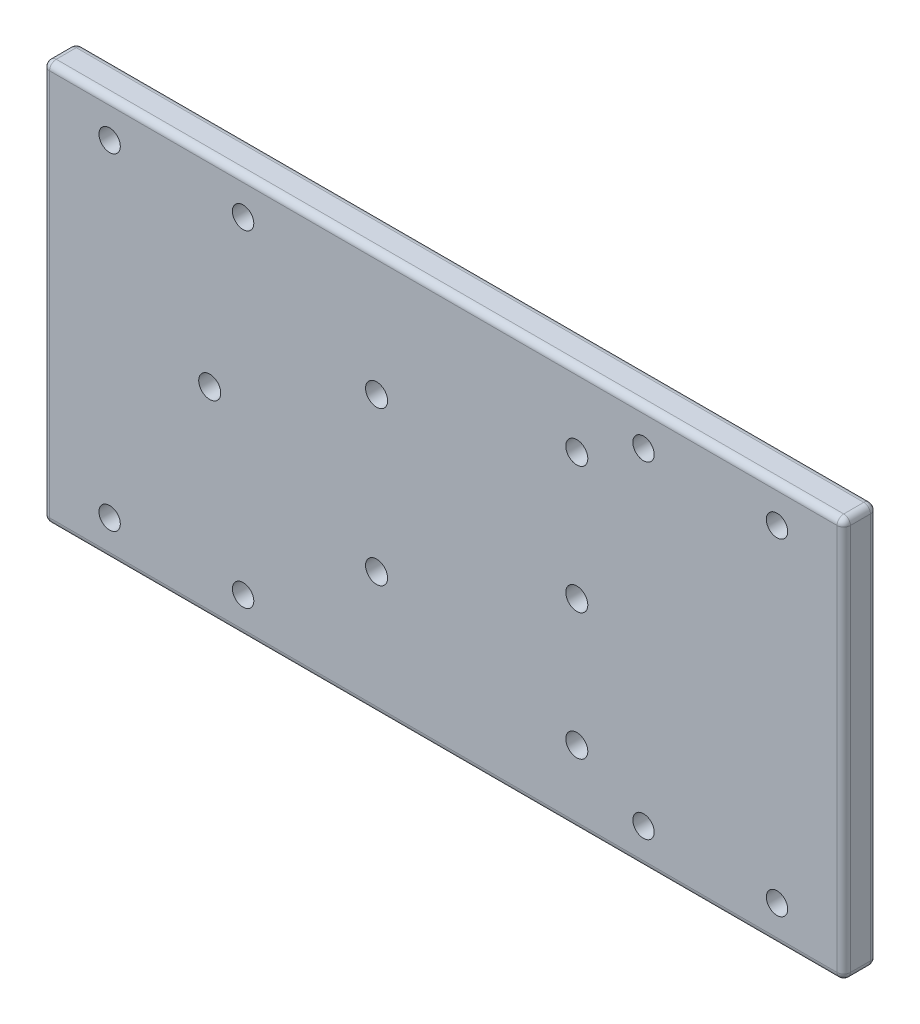
ISO-10303-21;
HEADER;
FILE_DESCRIPTION(('STEP AP214'),'2;1');
FILE_NAME('part.step','',(''),(''),'','','');
FILE_SCHEMA(('AUTOMOTIVE_DESIGN { 1 0 10303 214 1 1 1 1 }'));
ENDSEC;
DATA;
#1=APPLICATION_CONTEXT('core data for automotive mechanical design processes');
#2=APPLICATION_PROTOCOL_DEFINITION('international standard','automotive_design',2000,#1);
#3=PRODUCT_CONTEXT('',#1,'mechanical');
#4=PRODUCT('Part','Part','',(#3));
#5=PRODUCT_RELATED_PRODUCT_CATEGORY('part','',(#4));
#6=PRODUCT_DEFINITION_FORMATION('','',#4);
#7=PRODUCT_DEFINITION_CONTEXT('part definition',#1,'design');
#8=PRODUCT_DEFINITION('design','',#6,#7);
#9=PRODUCT_DEFINITION_SHAPE('','',#8);
#10=(LENGTH_UNIT() NAMED_UNIT(*) SI_UNIT(.MILLI.,.METRE.));
#11=(NAMED_UNIT(*) PLANE_ANGLE_UNIT() SI_UNIT($,.RADIAN.));
#12=(NAMED_UNIT(*) SI_UNIT($,.STERADIAN.) SOLID_ANGLE_UNIT());
#13=UNCERTAINTY_MEASURE_WITH_UNIT(LENGTH_MEASURE(1.E-05),#10,'distance_accuracy_value','');
#14=(GEOMETRIC_REPRESENTATION_CONTEXT(3) GLOBAL_UNCERTAINTY_ASSIGNED_CONTEXT((#13)) GLOBAL_UNIT_ASSIGNED_CONTEXT((#10,
#11,#12)) REPRESENTATION_CONTEXT('',''));
#15=CARTESIAN_POINT('',(0.,0.,0.));
#16=DIRECTION('',(0.,0.,1.));
#17=DIRECTION('',(1.,0.,0.));
#18=AXIS2_PLACEMENT_3D('',#15,#16,#17);
#19=CARTESIAN_POINT('',(20.,5.50000000000001,5.));
#20=DIRECTION('',(-1.,0.,0.));
#21=DIRECTION('',(0.,0.,1.));
#22=AXIS2_PLACEMENT_3D('',#19,#20,#21);
#23=PLANE('',#22);
#24=DIRECTION('',(0.,1.,0.));
#25=VECTOR('',#24,1.);
#26=CARTESIAN_POINT('',(20.,5.50000000000001,4.));
#27=LINE('',#26,#25);
#28=CARTESIAN_POINT('',(20.,4.5,4.));
#29=VERTEX_POINT('',#28);
#30=CARTESIAN_POINT('',(20.,-53.5,4.));
#31=VERTEX_POINT('',#30);
#32=EDGE_CURVE('E50',#29,#31,#27,.F.);
#33=ORIENTED_EDGE('',*,*,#32,.T.);
#34=DIRECTION('',(0.,0.,-1.));
#35=VECTOR('',#34,1.);
#36=CARTESIAN_POINT('',(20.,-53.5,5.));
#37=LINE('',#36,#35);
#38=CARTESIAN_POINT('',(20.,-53.5,1.));
#39=VERTEX_POINT('',#38);
#40=EDGE_CURVE('E11',#31,#39,#37,.T.);
#41=ORIENTED_EDGE('',*,*,#40,.T.);
#42=DIRECTION('',(0.,1.,0.));
#43=VECTOR('',#42,1.);
#44=CARTESIAN_POINT('',(20.,5.50000000000001,1.));
#45=LINE('',#44,#43);
#46=CARTESIAN_POINT('',(20.,4.5,1.));
#47=VERTEX_POINT('',#46);
#48=EDGE_CURVE('E204',#39,#47,#45,.T.);
#49=ORIENTED_EDGE('',*,*,#48,.T.);
#50=DIRECTION('',(0.,0.,-1.));
#51=VECTOR('',#50,1.);
#52=CARTESIAN_POINT('',(20.,4.5,5.));
#53=LINE('',#52,#51);
#54=EDGE_CURVE('E61',#47,#29,#53,.F.);
#55=ORIENTED_EDGE('',*,*,#54,.T.);
#56=EDGE_LOOP('',(#33,#41,#49,#55));
#57=FACE_BOUND('',#56,.T.);
#58=ADVANCED_FACE('F41',(#57),#23,.F.);
#59=CARTESIAN_POINT('',(20.,5.50000000000001,5.));
#60=DIRECTION('',(0.,-1.,0.));
#61=DIRECTION('',(1.,0.,0.));
#62=AXIS2_PLACEMENT_3D('',#59,#60,#61);
#63=PLANE('',#62);
#64=DIRECTION('',(0.,0.,-1.));
#65=VECTOR('',#64,1.);
#66=CARTESIAN_POINT('',(-99.,5.50000000000002,5.));
#67=LINE('',#66,#65);
#68=CARTESIAN_POINT('',(-99.,5.50000000000002,1.));
#69=VERTEX_POINT('',#68);
#70=CARTESIAN_POINT('',(-99.,5.50000000000002,4.));
#71=VERTEX_POINT('',#70);
#72=EDGE_CURVE('E199',#69,#71,#67,.F.);
#73=ORIENTED_EDGE('',*,*,#72,.T.);
#74=DIRECTION('',(-1.,0.,0.));
#75=VECTOR('',#74,1.);
#76=CARTESIAN_POINT('',(20.,5.50000000000001,4.));
#77=LINE('',#76,#75);
#78=CARTESIAN_POINT('',(19.,5.50000000000001,4.));
#79=VERTEX_POINT('',#78);
#80=EDGE_CURVE('E201',#71,#79,#77,.F.);
#81=ORIENTED_EDGE('',*,*,#80,.T.);
#82=DIRECTION('',(0.,0.,-1.));
#83=VECTOR('',#82,1.);
#84=CARTESIAN_POINT('',(19.,5.50000000000001,5.));
#85=LINE('',#84,#83);
#86=CARTESIAN_POINT('',(19.,5.50000000000001,1.));
#87=VERTEX_POINT('',#86);
#88=EDGE_CURVE('E195',#79,#87,#85,.T.);
#89=ORIENTED_EDGE('',*,*,#88,.T.);
#90=DIRECTION('',(-1.,0.,0.));
#91=VECTOR('',#90,1.);
#92=CARTESIAN_POINT('',(-100.,5.50000000000002,1.));
#93=LINE('',#92,#91);
#94=EDGE_CURVE('E197',#87,#69,#93,.T.);
#95=ORIENTED_EDGE('',*,*,#94,.T.);
#96=EDGE_LOOP('',(#73,#81,#89,#95));
#97=FACE_BOUND('',#96,.T.);
#98=ADVANCED_FACE('F396',(#97),#63,.F.);
#99=CARTESIAN_POINT('',(-100.,5.50000000000002,5.));
#100=DIRECTION('',(1.,0.,0.));
#101=DIRECTION('',(0.,0.,-1.));
#102=AXIS2_PLACEMENT_3D('',#99,#100,#101);
#103=PLANE('',#102);
#104=DIRECTION('',(0.,0.,-1.));
#105=VECTOR('',#104,1.);
#106=CARTESIAN_POINT('',(-100.,-53.5,5.));
#107=LINE('',#106,#105);
#108=CARTESIAN_POINT('',(-100.,-53.5,1.));
#109=VERTEX_POINT('',#108);
#110=CARTESIAN_POINT('',(-100.,-53.5,4.));
#111=VERTEX_POINT('',#110);
#112=EDGE_CURVE('E190',#109,#111,#107,.F.);
#113=ORIENTED_EDGE('',*,*,#112,.T.);
#114=DIRECTION('',(0.,-1.,0.));
#115=VECTOR('',#114,1.);
#116=CARTESIAN_POINT('',(-100.,5.50000000000002,4.));
#117=LINE('',#116,#115);
#118=CARTESIAN_POINT('',(-100.,4.50000000000002,4.));
#119=VERTEX_POINT('',#118);
#120=EDGE_CURVE('E192',#111,#119,#117,.F.);
#121=ORIENTED_EDGE('',*,*,#120,.T.);
#122=DIRECTION('',(0.,0.,-1.));
#123=VECTOR('',#122,1.);
#124=CARTESIAN_POINT('',(-100.,4.50000000000002,5.));
#125=LINE('',#124,#123);
#126=CARTESIAN_POINT('',(-100.,4.50000000000002,1.));
#127=VERTEX_POINT('',#126);
#128=EDGE_CURVE('E186',#119,#127,#125,.T.);
#129=ORIENTED_EDGE('',*,*,#128,.T.);
#130=DIRECTION('',(0.,-1.,0.));
#131=VECTOR('',#130,1.);
#132=CARTESIAN_POINT('',(-100.,-54.5,1.));
#133=LINE('',#132,#131);
#134=EDGE_CURVE('E188',#127,#109,#133,.T.);
#135=ORIENTED_EDGE('',*,*,#134,.T.);
#136=EDGE_LOOP('',(#113,#121,#129,#135));
#137=FACE_BOUND('',#136,.T.);
#138=ADVANCED_FACE('F402',(#137),#103,.F.);
#139=CARTESIAN_POINT('',(20.,-54.5,5.));
#140=DIRECTION('',(0.,1.,0.));
#141=DIRECTION('',(-1.,0.,0.));
#142=AXIS2_PLACEMENT_3D('',#139,#140,#141);
#143=PLANE('',#142);
#144=DIRECTION('',(1.,0.,0.));
#145=VECTOR('',#144,1.);
#146=CARTESIAN_POINT('',(20.,-54.5,4.));
#147=LINE('',#146,#145);
#148=CARTESIAN_POINT('',(19.,-54.5,4.));
#149=VERTEX_POINT('',#148);
#150=CARTESIAN_POINT('',(-99.,-54.5,4.));
#151=VERTEX_POINT('',#150);
#152=EDGE_CURVE('E137',#149,#151,#147,.F.);
#153=ORIENTED_EDGE('',*,*,#152,.T.);
#154=DIRECTION('',(0.,0.,-1.));
#155=VECTOR('',#154,1.);
#156=CARTESIAN_POINT('',(-99.,-54.5,5.));
#157=LINE('',#156,#155);
#158=CARTESIAN_POINT('',(-99.,-54.5,1.));
#159=VERTEX_POINT('',#158);
#160=EDGE_CURVE('E175',#151,#159,#157,.T.);
#161=ORIENTED_EDGE('',*,*,#160,.T.);
#162=DIRECTION('',(1.,0.,0.));
#163=VECTOR('',#162,1.);
#164=CARTESIAN_POINT('',(20.,-54.5,1.));
#165=LINE('',#164,#163);
#166=CARTESIAN_POINT('',(19.,-54.5,1.));
#167=VERTEX_POINT('',#166);
#168=EDGE_CURVE('E168',#159,#167,#165,.T.);
#169=ORIENTED_EDGE('',*,*,#168,.T.);
#170=DIRECTION('',(0.,0.,-1.));
#171=VECTOR('',#170,1.);
#172=CARTESIAN_POINT('',(19.,-54.5,5.));
#173=LINE('',#172,#171);
#174=EDGE_CURVE('E166',#167,#149,#173,.F.);
#175=ORIENTED_EDGE('',*,*,#174,.T.);
#176=EDGE_LOOP('',(#153,#161,#169,#175));
#177=FACE_BOUND('',#176,.T.);
#178=ADVANCED_FACE('F367',(#177),#143,.F.);
#179=CARTESIAN_POINT('',(0.,0.,5.));
#180=DIRECTION('',(0.,0.,-1.));
#181=DIRECTION('',(-1.,0.,0.));
#182=AXIS2_PLACEMENT_3D('',#179,#180,#181);
#183=PLANE('',#182);
#184=DIRECTION('',(0.,-1.,0.));
#185=VECTOR('',#184,1.);
#186=CARTESIAN_POINT('',(-99.,0.,5.));
#187=LINE('',#186,#185);
#188=CARTESIAN_POINT('',(-99.,4.50000000000002,5.));
#189=VERTEX_POINT('',#188);
#190=CARTESIAN_POINT('',(-99.,-53.5,5.));
#191=VERTEX_POINT('',#190);
#192=EDGE_CURVE('E164',#189,#191,#187,.T.);
#193=ORIENTED_EDGE('',*,*,#192,.T.);
#194=DIRECTION('',(1.,0.,0.));
#195=VECTOR('',#194,1.);
#196=CARTESIAN_POINT('',(0.,-53.5,5.));
#197=LINE('',#196,#195);
#198=CARTESIAN_POINT('',(19.,-53.5,5.));
#199=VERTEX_POINT('',#198);
#200=EDGE_CURVE('E135',#191,#199,#197,.T.);
#201=ORIENTED_EDGE('',*,*,#200,.T.);
#202=DIRECTION('',(0.,1.,0.));
#203=VECTOR('',#202,1.);
#204=CARTESIAN_POINT('',(19.,0.,5.));
#205=LINE('',#204,#203);
#206=CARTESIAN_POINT('',(19.,4.5,5.));
#207=VERTEX_POINT('',#206);
#208=EDGE_CURVE('E152',#199,#207,#205,.T.);
#209=ORIENTED_EDGE('',*,*,#208,.T.);
#210=DIRECTION('',(-1.,0.,0.));
#211=VECTOR('',#210,1.);
#212=CARTESIAN_POINT('',(0.,4.50000000000001,5.));
#213=LINE('',#212,#211);
#214=EDGE_CURVE('E158',#207,#189,#213,.T.);
#215=ORIENTED_EDGE('',*,*,#214,.T.);
#216=EDGE_LOOP('',(#193,#201,#209,#215));
#217=FACE_BOUND('',#216,.T.);
#218=CARTESIAN_POINT('',(-20.,-43.5,5.));
#219=DIRECTION('',(0.,0.,1.));
#220=DIRECTION('',(1.,0.,0.));
#221=AXIS2_PLACEMENT_3D('',#218,#219,#220);
#222=CIRCLE('',#221,1.65);
#223=CARTESIAN_POINT('',(-18.35,-43.5,5.));
#224=VERTEX_POINT('',#223);
#225=EDGE_CURVE('E295',#224,#224,#222,.T.);
#226=ORIENTED_EDGE('',*,*,#225,.F.);
#227=EDGE_LOOP('',(#226));
#228=FACE_BOUND('',#227,.T.);
#229=CARTESIAN_POINT('',(-20.,-24.5,5.));
#230=DIRECTION('',(0.,0.,1.));
#231=DIRECTION('',(1.,0.,0.));
#232=AXIS2_PLACEMENT_3D('',#229,#230,#231);
#233=CIRCLE('',#232,1.65);
#234=CARTESIAN_POINT('',(-18.35,-24.5,5.));
#235=VERTEX_POINT('',#234);
#236=EDGE_CURVE('E274',#235,#235,#233,.T.);
#237=ORIENTED_EDGE('',*,*,#236,.F.);
#238=EDGE_LOOP('',(#237));
#239=FACE_BOUND('',#238,.T.);
#240=CARTESIAN_POINT('',(-20.,-5.49999999999999,5.));
#241=DIRECTION('',(0.,0.,1.));
#242=DIRECTION('',(1.,0.,0.));
#243=AXIS2_PLACEMENT_3D('',#240,#241,#242);
#244=CIRCLE('',#243,1.65);
#245=CARTESIAN_POINT('',(-18.35,-5.49999999999999,5.));
#246=VERTEX_POINT('',#245);
#247=EDGE_CURVE('E263',#246,#246,#244,.T.);
#248=ORIENTED_EDGE('',*,*,#247,.F.);
#249=EDGE_LOOP('',(#248));
#250=FACE_BOUND('',#249,.T.);
#251=CARTESIAN_POINT('',(-10.,-49.,5.));
#252=DIRECTION('',(0.,0.,-1.));
#253=DIRECTION('',(-1.,0.,0.));
#254=AXIS2_PLACEMENT_3D('',#251,#252,#253);
#255=CIRCLE('',#254,1.6);
#256=CARTESIAN_POINT('',(-11.6,-49.,5.));
#257=VERTEX_POINT('',#256);
#258=EDGE_CURVE('E285',#257,#257,#255,.F.);
#259=ORIENTED_EDGE('',*,*,#258,.F.);
#260=EDGE_LOOP('',(#259));
#261=FACE_BOUND('',#260,.T.);
#262=CARTESIAN_POINT('',(-90.,-49.,5.));
#263=DIRECTION('',(0.,0.,-1.));
#264=DIRECTION('',(-1.,0.,0.));
#265=AXIS2_PLACEMENT_3D('',#262,#263,#264);
#266=CIRCLE('',#265,1.59999999999999);
#267=CARTESIAN_POINT('',(-91.6,-49.,5.));
#268=VERTEX_POINT('',#267);
#269=EDGE_CURVE('E298',#268,#268,#266,.F.);
#270=ORIENTED_EDGE('',*,*,#269,.F.);
#271=EDGE_LOOP('',(#270));
#272=FACE_BOUND('',#271,.T.);
#273=CARTESIAN_POINT('',(-70.,-49.,5.));
#274=DIRECTION('',(0.,0.,-1.));
#275=DIRECTION('',(-1.,0.,0.));
#276=AXIS2_PLACEMENT_3D('',#273,#274,#275);
#277=CIRCLE('',#276,1.59999999999999);
#278=CARTESIAN_POINT('',(-71.6,-49.,5.));
#279=VERTEX_POINT('',#278);
#280=EDGE_CURVE('E305',#279,#279,#277,.F.);
#281=ORIENTED_EDGE('',*,*,#280,.F.);
#282=EDGE_LOOP('',(#281));
#283=FACE_BOUND('',#282,.T.);
#284=CARTESIAN_POINT('',(-70.,0.,5.));
#285=DIRECTION('',(0.,0.,-1.));
#286=DIRECTION('',(-1.,0.,0.));
#287=AXIS2_PLACEMENT_3D('',#284,#285,#286);
#288=CIRCLE('',#287,1.60000000000001);
#289=CARTESIAN_POINT('',(-71.6,0.,5.));
#290=VERTEX_POINT('',#289);
#291=EDGE_CURVE('E310',#290,#290,#288,.F.);
#292=ORIENTED_EDGE('',*,*,#291,.F.);
#293=EDGE_LOOP('',(#292));
#294=FACE_BOUND('',#293,.T.);
#295=CARTESIAN_POINT('',(10.,-49.,5.));
#296=DIRECTION('',(0.,0.,-1.));
#297=DIRECTION('',(-1.,0.,0.));
#298=AXIS2_PLACEMENT_3D('',#295,#296,#297);
#299=CIRCLE('',#298,1.6);
#300=CARTESIAN_POINT('',(8.4,-49.,5.));
#301=VERTEX_POINT('',#300);
#302=EDGE_CURVE('E278',#301,#301,#299,.F.);
#303=ORIENTED_EDGE('',*,*,#302,.F.);
#304=EDGE_LOOP('',(#303));
#305=FACE_BOUND('',#304,.T.);
#306=CARTESIAN_POINT('',(10.,0.,5.));
#307=DIRECTION('',(0.,0.,-1.));
#308=DIRECTION('',(-1.,0.,0.));
#309=AXIS2_PLACEMENT_3D('',#306,#307,#308);
#310=CIRCLE('',#309,1.6);
#311=CARTESIAN_POINT('',(8.4,0.,5.));
#312=VERTEX_POINT('',#311);
#313=EDGE_CURVE('E286',#312,#312,#310,.F.);
#314=ORIENTED_EDGE('',*,*,#313,.F.);
#315=EDGE_LOOP('',(#314));
#316=FACE_BOUND('',#315,.T.);
#317=CARTESIAN_POINT('',(-10.,0.,5.));
#318=DIRECTION('',(0.,0.,-1.));
#319=DIRECTION('',(-1.,0.,0.));
#320=AXIS2_PLACEMENT_3D('',#317,#318,#319);
#321=CIRCLE('',#320,1.6);
#322=CARTESIAN_POINT('',(-11.6,0.,5.));
#323=VERTEX_POINT('',#322);
#324=EDGE_CURVE('E292',#323,#323,#321,.F.);
#325=ORIENTED_EDGE('',*,*,#324,.F.);
#326=EDGE_LOOP('',(#325));
#327=FACE_BOUND('',#326,.T.);
#328=CARTESIAN_POINT('',(-90.,0.,5.));
#329=DIRECTION('',(0.,0.,-1.));
#330=DIRECTION('',(-1.,0.,0.));
#331=AXIS2_PLACEMENT_3D('',#328,#329,#330);
#332=CIRCLE('',#331,1.6);
#333=CARTESIAN_POINT('',(-91.6,0.,5.));
#334=VERTEX_POINT('',#333);
#335=EDGE_CURVE('E324',#334,#334,#332,.F.);
#336=ORIENTED_EDGE('',*,*,#335,.F.);
#337=EDGE_LOOP('',(#336));
#338=FACE_BOUND('',#337,.T.);
#339=CARTESIAN_POINT('',(-50.,-13.,5.));
#340=DIRECTION('',(0.,0.,1.));
#341=DIRECTION('',(1.,0.,0.));
#342=AXIS2_PLACEMENT_3D('',#339,#340,#341);
#343=CIRCLE('',#342,1.65);
#344=CARTESIAN_POINT('',(-48.35,-13.,5.));
#345=VERTEX_POINT('',#344);
#346=EDGE_CURVE('E159',#345,#345,#343,.T.);
#347=ORIENTED_EDGE('',*,*,#346,.F.);
#348=EDGE_LOOP('',(#347));
#349=FACE_BOUND('',#348,.T.);
#350=CARTESIAN_POINT('',(-75.,-24.5,5.));
#351=DIRECTION('',(0.,0.,1.));
#352=DIRECTION('',(1.,0.,0.));
#353=AXIS2_PLACEMENT_3D('',#350,#351,#352);
#354=CIRCLE('',#353,1.65);
#355=CARTESIAN_POINT('',(-73.35,-24.5,5.));
#356=VERTEX_POINT('',#355);
#357=EDGE_CURVE('E336',#356,#356,#354,.T.);
#358=ORIENTED_EDGE('',*,*,#357,.F.);
#359=EDGE_LOOP('',(#358));
#360=FACE_BOUND('',#359,.T.);
#361=CARTESIAN_POINT('',(-50.,-36.,5.));
#362=DIRECTION('',(0.,0.,1.));
#363=DIRECTION('',(1.,0.,0.));
#364=AXIS2_PLACEMENT_3D('',#361,#362,#363);
#365=CIRCLE('',#364,1.65000000000001);
#366=CARTESIAN_POINT('',(-48.3499999999999,-36.,5.));
#367=VERTEX_POINT('',#366);
#368=EDGE_CURVE('E327',#367,#367,#365,.T.);
#369=ORIENTED_EDGE('',*,*,#368,.F.);
#370=EDGE_LOOP('',(#369));
#371=FACE_BOUND('',#370,.T.);
#372=ADVANCED_FACE('F161',(#217,#228,#239,#250,#261,#272,#283,#294,#305,#316,#327,#338,#349,
#360,#371),#183,.F.);
#373=CARTESIAN_POINT('',(0.,0.,0.));
#374=DIRECTION('',(0.,0.,-1.));
#375=DIRECTION('',(-1.,0.,0.));
#376=AXIS2_PLACEMENT_3D('',#373,#374,#375);
#377=PLANE('',#376);
#378=DIRECTION('',(0.,1.,0.));
#379=VECTOR('',#378,1.);
#380=CARTESIAN_POINT('',(19.,-54.5,0.));
#381=LINE('',#380,#379);
#382=CARTESIAN_POINT('',(19.,4.5,0.));
#383=VERTEX_POINT('',#382);
#384=CARTESIAN_POINT('',(19.,-53.5,0.));
#385=VERTEX_POINT('',#384);
#386=EDGE_CURVE('E177',#383,#385,#381,.F.);
#387=ORIENTED_EDGE('',*,*,#386,.T.);
#388=DIRECTION('',(1.,0.,0.));
#389=VECTOR('',#388,1.);
#390=CARTESIAN_POINT('',(-100.,-53.5,0.));
#391=LINE('',#390,#389);
#392=CARTESIAN_POINT('',(-99.,-53.5,0.));
#393=VERTEX_POINT('',#392);
#394=EDGE_CURVE('E183',#385,#393,#391,.F.);
#395=ORIENTED_EDGE('',*,*,#394,.T.);
#396=DIRECTION('',(0.,-1.,0.));
#397=VECTOR('',#396,1.);
#398=CARTESIAN_POINT('',(-99.,5.50000000000002,0.));
#399=LINE('',#398,#397);
#400=CARTESIAN_POINT('',(-99.,4.50000000000002,0.));
#401=VERTEX_POINT('',#400);
#402=EDGE_CURVE('E181',#393,#401,#399,.F.);
#403=ORIENTED_EDGE('',*,*,#402,.T.);
#404=DIRECTION('',(-1.,0.,0.));
#405=VECTOR('',#404,1.);
#406=CARTESIAN_POINT('',(20.,4.5,0.));
#407=LINE('',#406,#405);
#408=EDGE_CURVE('E179',#401,#383,#407,.F.);
#409=ORIENTED_EDGE('',*,*,#408,.T.);
#410=EDGE_LOOP('',(#387,#395,#403,#409));
#411=FACE_BOUND('',#410,.T.);
#412=CARTESIAN_POINT('',(-20.,-43.5,0.));
#413=DIRECTION('',(0.,0.,-1.));
#414=DIRECTION('',(-1.,0.,0.));
#415=AXIS2_PLACEMENT_3D('',#412,#413,#414);
#416=CIRCLE('',#415,1.65);
#417=CARTESIAN_POINT('',(-21.65,-43.5,0.));
#418=VERTEX_POINT('',#417);
#419=EDGE_CURVE('E746',#418,#418,#416,.F.);
#420=ORIENTED_EDGE('',*,*,#419,.T.);
#421=EDGE_LOOP('',(#420));
#422=FACE_BOUND('',#421,.T.);
#423=CARTESIAN_POINT('',(-20.,-24.5,0.));
#424=DIRECTION('',(0.,0.,-1.));
#425=DIRECTION('',(-1.,0.,0.));
#426=AXIS2_PLACEMENT_3D('',#423,#424,#425);
#427=CIRCLE('',#426,1.65);
#428=CARTESIAN_POINT('',(-21.65,-24.5,0.));
#429=VERTEX_POINT('',#428);
#430=EDGE_CURVE('E750',#429,#429,#427,.F.);
#431=ORIENTED_EDGE('',*,*,#430,.T.);
#432=EDGE_LOOP('',(#431));
#433=FACE_BOUND('',#432,.T.);
#434=CARTESIAN_POINT('',(-20.,-5.49999999999999,0.));
#435=DIRECTION('',(0.,0.,-1.));
#436=DIRECTION('',(-1.,0.,0.));
#437=AXIS2_PLACEMENT_3D('',#434,#435,#436);
#438=CIRCLE('',#437,1.65);
#439=CARTESIAN_POINT('',(-21.65,-5.49999999999999,0.));
#440=VERTEX_POINT('',#439);
#441=EDGE_CURVE('E269',#440,#440,#438,.F.);
#442=ORIENTED_EDGE('',*,*,#441,.T.);
#443=EDGE_LOOP('',(#442));
#444=FACE_BOUND('',#443,.T.);
#445=CARTESIAN_POINT('',(-10.,-49.,0.));
#446=DIRECTION('',(0.,0.,-1.));
#447=DIRECTION('',(-1.,0.,0.));
#448=AXIS2_PLACEMENT_3D('',#445,#446,#447);
#449=CIRCLE('',#448,1.6);
#450=CARTESIAN_POINT('',(-11.6,-49.,0.));
#451=VERTEX_POINT('',#450);
#452=EDGE_CURVE('E302',#451,#451,#449,.T.);
#453=ORIENTED_EDGE('',*,*,#452,.F.);
#454=EDGE_LOOP('',(#453));
#455=FACE_BOUND('',#454,.T.);
#456=CARTESIAN_POINT('',(-90.,-49.,0.));
#457=DIRECTION('',(0.,0.,-1.));
#458=DIRECTION('',(-1.,0.,0.));
#459=AXIS2_PLACEMENT_3D('',#456,#457,#458);
#460=CIRCLE('',#459,1.59999999999999);
#461=CARTESIAN_POINT('',(-91.6,-49.,0.));
#462=VERTEX_POINT('',#461);
#463=EDGE_CURVE('E301',#462,#462,#460,.T.);
#464=ORIENTED_EDGE('',*,*,#463,.F.);
#465=EDGE_LOOP('',(#464));
#466=FACE_BOUND('',#465,.T.);
#467=CARTESIAN_POINT('',(-70.,-49.,0.));
#468=DIRECTION('',(0.,0.,-1.));
#469=DIRECTION('',(-1.,0.,0.));
#470=AXIS2_PLACEMENT_3D('',#467,#468,#469);
#471=CIRCLE('',#470,1.59999999999999);
#472=CARTESIAN_POINT('',(-71.6,-49.,0.));
#473=VERTEX_POINT('',#472);
#474=EDGE_CURVE('E314',#473,#473,#471,.T.);
#475=ORIENTED_EDGE('',*,*,#474,.F.);
#476=EDGE_LOOP('',(#475));
#477=FACE_BOUND('',#476,.T.);
#478=CARTESIAN_POINT('',(-70.,0.,0.));
#479=DIRECTION('',(0.,0.,-1.));
#480=DIRECTION('',(-1.,0.,0.));
#481=AXIS2_PLACEMENT_3D('',#478,#479,#480);
#482=CIRCLE('',#481,1.60000000000001);
#483=CARTESIAN_POINT('',(-71.6,0.,0.));
#484=VERTEX_POINT('',#483);
#485=EDGE_CURVE('E313',#484,#484,#482,.T.);
#486=ORIENTED_EDGE('',*,*,#485,.F.);
#487=EDGE_LOOP('',(#486));
#488=FACE_BOUND('',#487,.T.);
#489=CARTESIAN_POINT('',(10.,-49.,0.));
#490=DIRECTION('',(0.,0.,-1.));
#491=DIRECTION('',(-1.,0.,0.));
#492=AXIS2_PLACEMENT_3D('',#489,#490,#491);
#493=CIRCLE('',#492,1.6);
#494=CARTESIAN_POINT('',(8.4,-49.,0.));
#495=VERTEX_POINT('',#494);
#496=EDGE_CURVE('E281',#495,#495,#493,.T.);
#497=ORIENTED_EDGE('',*,*,#496,.F.);
#498=EDGE_LOOP('',(#497));
#499=FACE_BOUND('',#498,.T.);
#500=CARTESIAN_POINT('',(10.,0.,0.));
#501=DIRECTION('',(0.,0.,-1.));
#502=DIRECTION('',(-1.,0.,0.));
#503=AXIS2_PLACEMENT_3D('',#500,#501,#502);
#504=CIRCLE('',#503,1.6);
#505=CARTESIAN_POINT('',(8.4,0.,0.));
#506=VERTEX_POINT('',#505);
#507=EDGE_CURVE('E282',#506,#506,#504,.T.);
#508=ORIENTED_EDGE('',*,*,#507,.F.);
#509=EDGE_LOOP('',(#508));
#510=FACE_BOUND('',#509,.T.);
#511=CARTESIAN_POINT('',(-10.,0.,0.));
#512=DIRECTION('',(0.,0.,-1.));
#513=DIRECTION('',(-1.,0.,0.));
#514=AXIS2_PLACEMENT_3D('',#511,#512,#513);
#515=CIRCLE('',#514,1.6);
#516=CARTESIAN_POINT('',(-11.6,0.,0.));
#517=VERTEX_POINT('',#516);
#518=EDGE_CURVE('E289',#517,#517,#515,.T.);
#519=ORIENTED_EDGE('',*,*,#518,.F.);
#520=EDGE_LOOP('',(#519));
#521=FACE_BOUND('',#520,.T.);
#522=CARTESIAN_POINT('',(-90.,0.,0.));
#523=DIRECTION('',(0.,0.,-1.));
#524=DIRECTION('',(-1.,0.,0.));
#525=AXIS2_PLACEMENT_3D('',#522,#523,#524);
#526=CIRCLE('',#525,1.6);
#527=CARTESIAN_POINT('',(-91.6,0.,0.));
#528=VERTEX_POINT('',#527);
#529=EDGE_CURVE('E317',#528,#528,#526,.T.);
#530=ORIENTED_EDGE('',*,*,#529,.F.);
#531=EDGE_LOOP('',(#530));
#532=FACE_BOUND('',#531,.T.);
#533=CARTESIAN_POINT('',(-50.,-13.,0.));
#534=DIRECTION('',(0.,0.,-1.));
#535=DIRECTION('',(-1.,0.,0.));
#536=AXIS2_PLACEMENT_3D('',#533,#534,#535);
#537=CIRCLE('',#536,1.65);
#538=CARTESIAN_POINT('',(-51.65,-13.,0.));
#539=VERTEX_POINT('',#538);
#540=EDGE_CURVE('E330',#539,#539,#537,.F.);
#541=ORIENTED_EDGE('',*,*,#540,.T.);
#542=EDGE_LOOP('',(#541));
#543=FACE_BOUND('',#542,.T.);
#544=CARTESIAN_POINT('',(-75.,-24.5,0.));
#545=DIRECTION('',(0.,0.,-1.));
#546=DIRECTION('',(-1.,0.,0.));
#547=AXIS2_PLACEMENT_3D('',#544,#545,#546);
#548=CIRCLE('',#547,1.65);
#549=CARTESIAN_POINT('',(-76.6499999999999,-24.5,0.));
#550=VERTEX_POINT('',#549);
#551=EDGE_CURVE('E333',#550,#550,#548,.F.);
#552=ORIENTED_EDGE('',*,*,#551,.T.);
#553=EDGE_LOOP('',(#552));
#554=FACE_BOUND('',#553,.T.);
#555=CARTESIAN_POINT('',(-50.,-36.,0.));
#556=DIRECTION('',(0.,0.,-1.));
#557=DIRECTION('',(-1.,0.,0.));
#558=AXIS2_PLACEMENT_3D('',#555,#556,#557);
#559=CIRCLE('',#558,1.65000000000001);
#560=CARTESIAN_POINT('',(-51.65,-36.,0.));
#561=VERTEX_POINT('',#560);
#562=EDGE_CURVE('E339',#561,#561,#559,.F.);
#563=ORIENTED_EDGE('',*,*,#562,.T.);
#564=EDGE_LOOP('',(#563));
#565=FACE_BOUND('',#564,.T.);
#566=ADVANCED_FACE('F676',(#411,#422,#433,#444,#455,#466,#477,#488,#499,#510,#521,#532,#543,
#554,#565),#377,.T.);
#567=CARTESIAN_POINT('',(-50.,-36.,-0.00100000000000013));
#568=DIRECTION('',(0.,0.,1.));
#569=DIRECTION('',(1.,0.,0.));
#570=AXIS2_PLACEMENT_3D('',#567,#568,#569);
#571=CYLINDRICAL_SURFACE('',#570,1.65000000000001);
#572=ORIENTED_EDGE('',*,*,#562,.F.);
#573=EDGE_LOOP('',(#572));
#574=FACE_BOUND('',#573,.T.);
#575=ORIENTED_EDGE('',*,*,#368,.T.);
#576=EDGE_LOOP('',(#575));
#577=FACE_BOUND('',#576,.T.);
#578=ADVANCED_FACE('F667',(#574,#577),#571,.F.);
#579=CARTESIAN_POINT('',(-75.,-24.5,-0.00100000000000013));
#580=DIRECTION('',(0.,0.,1.));
#581=DIRECTION('',(1.,0.,0.));
#582=AXIS2_PLACEMENT_3D('',#579,#580,#581);
#583=CYLINDRICAL_SURFACE('',#582,1.65);
#584=ORIENTED_EDGE('',*,*,#551,.F.);
#585=EDGE_LOOP('',(#584));
#586=FACE_BOUND('',#585,.T.);
#587=ORIENTED_EDGE('',*,*,#357,.T.);
#588=EDGE_LOOP('',(#587));
#589=FACE_BOUND('',#588,.T.);
#590=ADVANCED_FACE('F658',(#586,#589),#583,.F.);
#591=CARTESIAN_POINT('',(-50.,-13.,-0.00100000000000013));
#592=DIRECTION('',(0.,0.,1.));
#593=DIRECTION('',(1.,0.,0.));
#594=AXIS2_PLACEMENT_3D('',#591,#592,#593);
#595=CYLINDRICAL_SURFACE('',#594,1.65);
#596=ORIENTED_EDGE('',*,*,#540,.F.);
#597=EDGE_LOOP('',(#596));
#598=FACE_BOUND('',#597,.T.);
#599=ORIENTED_EDGE('',*,*,#346,.T.);
#600=EDGE_LOOP('',(#599));
#601=FACE_BOUND('',#600,.T.);
#602=ADVANCED_FACE('F649',(#598,#601),#595,.F.);
#603=CARTESIAN_POINT('',(-90.,0.,5.001));
#604=DIRECTION('',(0.,0.,-1.));
#605=DIRECTION('',(-1.,0.,0.));
#606=AXIS2_PLACEMENT_3D('',#603,#604,#605);
#607=CYLINDRICAL_SURFACE('',#606,1.6);
#608=ORIENTED_EDGE('',*,*,#529,.T.);
#609=EDGE_LOOP('',(#608));
#610=FACE_BOUND('',#609,.T.);
#611=ORIENTED_EDGE('',*,*,#335,.T.);
#612=EDGE_LOOP('',(#611));
#613=FACE_BOUND('',#612,.T.);
#614=ADVANCED_FACE('F640',(#610,#613),#607,.F.);
#615=CARTESIAN_POINT('',(-10.,0.,5.001));
#616=DIRECTION('',(0.,0.,-1.));
#617=DIRECTION('',(-1.,0.,0.));
#618=AXIS2_PLACEMENT_3D('',#615,#616,#617);
#619=CYLINDRICAL_SURFACE('',#618,1.6);
#620=ORIENTED_EDGE('',*,*,#518,.T.);
#621=EDGE_LOOP('',(#620));
#622=FACE_BOUND('',#621,.T.);
#623=ORIENTED_EDGE('',*,*,#324,.T.);
#624=EDGE_LOOP('',(#623));
#625=FACE_BOUND('',#624,.T.);
#626=ADVANCED_FACE('F631',(#622,#625),#619,.F.);
#627=CARTESIAN_POINT('',(10.,0.,5.001));
#628=DIRECTION('',(0.,0.,-1.));
#629=DIRECTION('',(-1.,0.,0.));
#630=AXIS2_PLACEMENT_3D('',#627,#628,#629);
#631=CYLINDRICAL_SURFACE('',#630,1.6);
#632=ORIENTED_EDGE('',*,*,#507,.T.);
#633=EDGE_LOOP('',(#632));
#634=FACE_BOUND('',#633,.T.);
#635=ORIENTED_EDGE('',*,*,#313,.T.);
#636=EDGE_LOOP('',(#635));
#637=FACE_BOUND('',#636,.T.);
#638=ADVANCED_FACE('F622',(#634,#637),#631,.F.);
#639=CARTESIAN_POINT('',(10.,-49.,5.001));
#640=DIRECTION('',(0.,0.,-1.));
#641=DIRECTION('',(-1.,0.,0.));
#642=AXIS2_PLACEMENT_3D('',#639,#640,#641);
#643=CYLINDRICAL_SURFACE('',#642,1.6);
#644=ORIENTED_EDGE('',*,*,#496,.T.);
#645=EDGE_LOOP('',(#644));
#646=FACE_BOUND('',#645,.T.);
#647=ORIENTED_EDGE('',*,*,#302,.T.);
#648=EDGE_LOOP('',(#647));
#649=FACE_BOUND('',#648,.T.);
#650=ADVANCED_FACE('F613',(#646,#649),#643,.F.);
#651=CARTESIAN_POINT('',(-70.,0.,5.001));
#652=DIRECTION('',(0.,0.,-1.));
#653=DIRECTION('',(-1.,0.,0.));
#654=AXIS2_PLACEMENT_3D('',#651,#652,#653);
#655=CYLINDRICAL_SURFACE('',#654,1.60000000000001);
#656=ORIENTED_EDGE('',*,*,#485,.T.);
#657=EDGE_LOOP('',(#656));
#658=FACE_BOUND('',#657,.T.);
#659=ORIENTED_EDGE('',*,*,#291,.T.);
#660=EDGE_LOOP('',(#659));
#661=FACE_BOUND('',#660,.T.);
#662=ADVANCED_FACE('F604',(#658,#661),#655,.F.);
#663=CARTESIAN_POINT('',(-70.,-49.,5.001));
#664=DIRECTION('',(0.,0.,-1.));
#665=DIRECTION('',(-1.,0.,0.));
#666=AXIS2_PLACEMENT_3D('',#663,#664,#665);
#667=CYLINDRICAL_SURFACE('',#666,1.59999999999999);
#668=ORIENTED_EDGE('',*,*,#474,.T.);
#669=EDGE_LOOP('',(#668));
#670=FACE_BOUND('',#669,.T.);
#671=ORIENTED_EDGE('',*,*,#280,.T.);
#672=EDGE_LOOP('',(#671));
#673=FACE_BOUND('',#672,.T.);
#674=ADVANCED_FACE('F595',(#670,#673),#667,.F.);
#675=CARTESIAN_POINT('',(-90.,-49.,5.001));
#676=DIRECTION('',(0.,0.,-1.));
#677=DIRECTION('',(-1.,0.,0.));
#678=AXIS2_PLACEMENT_3D('',#675,#676,#677);
#679=CYLINDRICAL_SURFACE('',#678,1.59999999999999);
#680=ORIENTED_EDGE('',*,*,#463,.T.);
#681=EDGE_LOOP('',(#680));
#682=FACE_BOUND('',#681,.T.);
#683=ORIENTED_EDGE('',*,*,#269,.T.);
#684=EDGE_LOOP('',(#683));
#685=FACE_BOUND('',#684,.T.);
#686=ADVANCED_FACE('F586',(#682,#685),#679,.F.);
#687=CARTESIAN_POINT('',(-10.,-49.,5.001));
#688=DIRECTION('',(0.,0.,-1.));
#689=DIRECTION('',(-1.,0.,0.));
#690=AXIS2_PLACEMENT_3D('',#687,#688,#689);
#691=CYLINDRICAL_SURFACE('',#690,1.6);
#692=ORIENTED_EDGE('',*,*,#452,.T.);
#693=EDGE_LOOP('',(#692));
#694=FACE_BOUND('',#693,.T.);
#695=ORIENTED_EDGE('',*,*,#258,.T.);
#696=EDGE_LOOP('',(#695));
#697=FACE_BOUND('',#696,.T.);
#698=ADVANCED_FACE('F577',(#694,#697),#691,.F.);
#699=CARTESIAN_POINT('',(-20.,-5.49999999999999,-0.00100000000000013));
#700=DIRECTION('',(0.,0.,1.));
#701=DIRECTION('',(1.,0.,0.));
#702=AXIS2_PLACEMENT_3D('',#699,#700,#701);
#703=CYLINDRICAL_SURFACE('',#702,1.65);
#704=ORIENTED_EDGE('',*,*,#441,.F.);
#705=EDGE_LOOP('',(#704));
#706=FACE_BOUND('',#705,.T.);
#707=ORIENTED_EDGE('',*,*,#247,.T.);
#708=EDGE_LOOP('',(#707));
#709=FACE_BOUND('',#708,.T.);
#710=ADVANCED_FACE('F568',(#706,#709),#703,.F.);
#711=CARTESIAN_POINT('',(-20.,-24.5,-0.00100000000000013));
#712=DIRECTION('',(0.,0.,1.));
#713=DIRECTION('',(1.,0.,0.));
#714=AXIS2_PLACEMENT_3D('',#711,#712,#713);
#715=CYLINDRICAL_SURFACE('',#714,1.65);
#716=ORIENTED_EDGE('',*,*,#430,.F.);
#717=EDGE_LOOP('',(#716));
#718=FACE_BOUND('',#717,.T.);
#719=ORIENTED_EDGE('',*,*,#236,.T.);
#720=EDGE_LOOP('',(#719));
#721=FACE_BOUND('',#720,.T.);
#722=ADVANCED_FACE('F559',(#718,#721),#715,.F.);
#723=CARTESIAN_POINT('',(-20.,-43.5,-0.00100000000000013));
#724=DIRECTION('',(0.,0.,1.));
#725=DIRECTION('',(1.,0.,0.));
#726=AXIS2_PLACEMENT_3D('',#723,#724,#725);
#727=CYLINDRICAL_SURFACE('',#726,1.65);
#728=ORIENTED_EDGE('',*,*,#419,.F.);
#729=EDGE_LOOP('',(#728));
#730=FACE_BOUND('',#729,.T.);
#731=ORIENTED_EDGE('',*,*,#225,.T.);
#732=EDGE_LOOP('',(#731));
#733=FACE_BOUND('',#732,.T.);
#734=ADVANCED_FACE('F552',(#730,#733),#727,.F.);
#735=CARTESIAN_POINT('',(20.,4.5,1.));
#736=DIRECTION('',(1.,0.,0.));
#737=DIRECTION('',(0.,1.,0.));
#738=AXIS2_PLACEMENT_3D('',#735,#736,#737);
#739=CYLINDRICAL_SURFACE('',#738,1.);
#740=CARTESIAN_POINT('',(-99.,4.50000000000002,1.));
#741=DIRECTION('',(-1.,0.,0.));
#742=DIRECTION('',(0.,0.,1.));
#743=AXIS2_PLACEMENT_3D('',#740,#741,#742);
#744=CIRCLE('',#743,1.);
#745=EDGE_CURVE('E45',#69,#401,#744,.T.);
#746=ORIENTED_EDGE('',*,*,#745,.F.);
#747=ORIENTED_EDGE('',*,*,#94,.F.);
#748=CARTESIAN_POINT('',(19.,4.5,1.));
#749=DIRECTION('',(1.,0.,0.));
#750=DIRECTION('',(0.,0.,-1.));
#751=AXIS2_PLACEMENT_3D('',#748,#749,#750);
#752=CIRCLE('',#751,1.);
#753=EDGE_CURVE('E256',#383,#87,#752,.T.);
#754=ORIENTED_EDGE('',*,*,#753,.F.);
#755=ORIENTED_EDGE('',*,*,#408,.F.);
#756=EDGE_LOOP('',(#746,#747,#754,#755));
#757=FACE_BOUND('',#756,.T.);
#758=ADVANCED_FACE('F43',(#757),#739,.T.);
#759=CARTESIAN_POINT('',(-99.,4.50000000000002,1.));
#760=DIRECTION('',(0.,0.,-1.));
#761=DIRECTION('',(-1.,0.,0.));
#762=AXIS2_PLACEMENT_3D('',#759,#760,#761);
#763=SPHERICAL_SURFACE('',#762,1.);
#764=CARTESIAN_POINT('',(-99.,4.50000000000002,1.));
#765=DIRECTION('',(0.,0.,-1.));
#766=DIRECTION('',(-1.,0.,0.));
#767=AXIS2_PLACEMENT_3D('',#764,#765,#766);
#768=CIRCLE('',#767,1.);
#769=EDGE_CURVE('E251',#69,#127,#768,.F.);
#770=ORIENTED_EDGE('',*,*,#769,.F.);
#771=ORIENTED_EDGE('',*,*,#745,.T.);
#772=CARTESIAN_POINT('',(-99.,4.50000000000002,1.));
#773=DIRECTION('',(0.,1.,0.));
#774=DIRECTION('',(0.,0.,1.));
#775=AXIS2_PLACEMENT_3D('',#772,#773,#774);
#776=CIRCLE('',#775,1.);
#777=EDGE_CURVE('E254',#127,#401,#776,.F.);
#778=ORIENTED_EDGE('',*,*,#777,.F.);
#779=EDGE_LOOP('',(#770,#771,#778));
#780=FACE_BOUND('',#779,.T.);
#781=ADVANCED_FACE('F538',(#780),#763,.T.);
#782=CARTESIAN_POINT('',(19.,4.5,1.));
#783=DIRECTION('',(0.,1.,0.));
#784=DIRECTION('',(0.,0.,1.));
#785=AXIS2_PLACEMENT_3D('',#782,#783,#784);
#786=SPHERICAL_SURFACE('',#785,1.);
#787=CARTESIAN_POINT('',(19.,4.5,1.));
#788=DIRECTION('',(0.,1.,0.));
#789=DIRECTION('',(0.,0.,1.));
#790=AXIS2_PLACEMENT_3D('',#787,#788,#789);
#791=CIRCLE('',#790,1.);
#792=EDGE_CURVE('E245',#383,#47,#791,.F.);
#793=ORIENTED_EDGE('',*,*,#792,.F.);
#794=ORIENTED_EDGE('',*,*,#753,.T.);
#795=CARTESIAN_POINT('',(19.,4.5,1.));
#796=DIRECTION('',(0.,0.,-1.));
#797=DIRECTION('',(-1.,0.,0.));
#798=AXIS2_PLACEMENT_3D('',#795,#796,#797);
#799=CIRCLE('',#798,1.);
#800=EDGE_CURVE('E248',#47,#87,#799,.F.);
#801=ORIENTED_EDGE('',*,*,#800,.F.);
#802=EDGE_LOOP('',(#793,#794,#801));
#803=FACE_BOUND('',#802,.T.);
#804=ADVANCED_FACE('F378',(#803),#786,.T.);
#805=CARTESIAN_POINT('',(-99.,5.50000000000002,1.));
#806=DIRECTION('',(0.,1.,0.));
#807=DIRECTION('',(0.,0.,1.));
#808=AXIS2_PLACEMENT_3D('',#805,#806,#807);
#809=CYLINDRICAL_SURFACE('',#808,1.);
#810=ORIENTED_EDGE('',*,*,#777,.T.);
#811=ORIENTED_EDGE('',*,*,#402,.F.);
#812=CARTESIAN_POINT('',(-99.,-53.5,1.));
#813=DIRECTION('',(0.,-1.,0.));
#814=DIRECTION('',(0.,0.,-1.));
#815=AXIS2_PLACEMENT_3D('',#812,#813,#814);
#816=CIRCLE('',#815,1.);
#817=EDGE_CURVE('E240',#109,#393,#816,.T.);
#818=ORIENTED_EDGE('',*,*,#817,.F.);
#819=ORIENTED_EDGE('',*,*,#134,.F.);
#820=EDGE_LOOP('',(#810,#811,#818,#819));
#821=FACE_BOUND('',#820,.T.);
#822=ADVANCED_FACE('F521',(#821),#809,.T.);
#823=CARTESIAN_POINT('',(-99.,4.50000000000002,5.));
#824=DIRECTION('',(0.,0.,-1.));
#825=DIRECTION('',(-1.,0.,0.));
#826=AXIS2_PLACEMENT_3D('',#823,#824,#825);
#827=CYLINDRICAL_SURFACE('',#826,1.);
#828=ORIENTED_EDGE('',*,*,#769,.T.);
#829=ORIENTED_EDGE('',*,*,#128,.F.);
#830=CARTESIAN_POINT('',(-99.,4.50000000000002,4.));
#831=DIRECTION('',(0.,0.,1.));
#832=DIRECTION('',(1.,0.,0.));
#833=AXIS2_PLACEMENT_3D('',#830,#831,#832);
#834=CIRCLE('',#833,1.);
#835=EDGE_CURVE('E237',#71,#119,#834,.T.);
#836=ORIENTED_EDGE('',*,*,#835,.F.);
#837=ORIENTED_EDGE('',*,*,#72,.F.);
#838=EDGE_LOOP('',(#828,#829,#836,#837));
#839=FACE_BOUND('',#838,.T.);
#840=ADVANCED_FACE('F513',(#839),#827,.T.);
#841=CARTESIAN_POINT('',(0.,4.50000000000001,4.));
#842=DIRECTION('',(-1.,0.,0.));
#843=DIRECTION('',(0.,-1.,0.));
#844=AXIS2_PLACEMENT_3D('',#841,#842,#843);
#845=CYLINDRICAL_SURFACE('',#844,1.);
#846=CARTESIAN_POINT('',(19.,4.5,4.));
#847=DIRECTION('',(1.,0.,0.));
#848=DIRECTION('',(0.,0.,-1.));
#849=AXIS2_PLACEMENT_3D('',#846,#847,#848);
#850=CIRCLE('',#849,1.);
#851=EDGE_CURVE('E231',#79,#207,#850,.T.);
#852=ORIENTED_EDGE('',*,*,#851,.F.);
#853=ORIENTED_EDGE('',*,*,#80,.F.);
#854=CARTESIAN_POINT('',(-99.,4.50000000000002,4.));
#855=DIRECTION('',(-1.,0.,0.));
#856=DIRECTION('',(0.,0.,1.));
#857=AXIS2_PLACEMENT_3D('',#854,#855,#856);
#858=CIRCLE('',#857,1.);
#859=EDGE_CURVE('E234',#189,#71,#858,.T.);
#860=ORIENTED_EDGE('',*,*,#859,.F.);
#861=ORIENTED_EDGE('',*,*,#214,.F.);
#862=EDGE_LOOP('',(#852,#853,#860,#861));
#863=FACE_BOUND('',#862,.T.);
#864=ADVANCED_FACE('F348',(#863),#845,.T.);
#865=CARTESIAN_POINT('',(19.,4.5,5.));
#866=DIRECTION('',(0.,0.,-1.));
#867=DIRECTION('',(-1.,0.,0.));
#868=AXIS2_PLACEMENT_3D('',#865,#866,#867);
#869=CYLINDRICAL_SURFACE('',#868,1.);
#870=ORIENTED_EDGE('',*,*,#800,.T.);
#871=ORIENTED_EDGE('',*,*,#88,.F.);
#872=CARTESIAN_POINT('',(19.,4.5,4.));
#873=DIRECTION('',(0.,0.,1.));
#874=DIRECTION('',(1.,0.,0.));
#875=AXIS2_PLACEMENT_3D('',#872,#873,#874);
#876=CIRCLE('',#875,1.);
#877=EDGE_CURVE('E229',#29,#79,#876,.T.);
#878=ORIENTED_EDGE('',*,*,#877,.F.);
#879=ORIENTED_EDGE('',*,*,#54,.F.);
#880=EDGE_LOOP('',(#870,#871,#878,#879));
#881=FACE_BOUND('',#880,.T.);
#882=ADVANCED_FACE('F381',(#881),#869,.T.);
#883=CARTESIAN_POINT('',(19.,5.50000000000001,1.));
#884=DIRECTION('',(0.,-1.,0.));
#885=DIRECTION('',(0.,0.,-1.));
#886=AXIS2_PLACEMENT_3D('',#883,#884,#885);
#887=CYLINDRICAL_SURFACE('',#886,1.);
#888=ORIENTED_EDGE('',*,*,#792,.T.);
#889=ORIENTED_EDGE('',*,*,#48,.F.);
#890=CARTESIAN_POINT('',(19.,-53.5,1.));
#891=DIRECTION('',(0.,-1.,0.));
#892=DIRECTION('',(0.,0.,-1.));
#893=AXIS2_PLACEMENT_3D('',#890,#891,#892);
#894=CIRCLE('',#893,1.);
#895=EDGE_CURVE('E226',#385,#39,#894,.T.);
#896=ORIENTED_EDGE('',*,*,#895,.F.);
#897=ORIENTED_EDGE('',*,*,#386,.F.);
#898=EDGE_LOOP('',(#888,#889,#896,#897));
#899=FACE_BOUND('',#898,.T.);
#900=ADVANCED_FACE('F377',(#899),#887,.T.);
#901=CARTESIAN_POINT('',(20.,-53.5,1.));
#902=DIRECTION('',(-1.,0.,0.));
#903=DIRECTION('',(0.,-1.,0.));
#904=AXIS2_PLACEMENT_3D('',#901,#902,#903);
#905=CYLINDRICAL_SURFACE('',#904,1.);
#906=CARTESIAN_POINT('',(-99.,-53.5,1.));
#907=DIRECTION('',(-1.,0.,0.));
#908=DIRECTION('',(0.,0.,1.));
#909=AXIS2_PLACEMENT_3D('',#906,#907,#908);
#910=CIRCLE('',#909,1.);
#911=EDGE_CURVE('E242',#393,#159,#910,.T.);
#912=ORIENTED_EDGE('',*,*,#911,.F.);
#913=ORIENTED_EDGE('',*,*,#394,.F.);
#914=CARTESIAN_POINT('',(19.,-53.5,1.));
#915=DIRECTION('',(1.,0.,0.));
#916=DIRECTION('',(0.,0.,-1.));
#917=AXIS2_PLACEMENT_3D('',#914,#915,#916);
#918=CIRCLE('',#917,1.);
#919=EDGE_CURVE('E223',#167,#385,#918,.T.);
#920=ORIENTED_EDGE('',*,*,#919,.F.);
#921=ORIENTED_EDGE('',*,*,#168,.F.);
#922=EDGE_LOOP('',(#912,#913,#920,#921));
#923=FACE_BOUND('',#922,.T.);
#924=ADVANCED_FACE('F482',(#923),#905,.T.);
#925=CARTESIAN_POINT('',(-99.,-53.5,1.));
#926=DIRECTION('',(0.,0.,-1.));
#927=DIRECTION('',(-1.,0.,0.));
#928=AXIS2_PLACEMENT_3D('',#925,#926,#927);
#929=SPHERICAL_SURFACE('',#928,1.);
#930=ORIENTED_EDGE('',*,*,#817,.T.);
#931=ORIENTED_EDGE('',*,*,#911,.T.);
#932=CARTESIAN_POINT('',(-99.,-53.5,1.));
#933=DIRECTION('',(0.,0.,-1.));
#934=DIRECTION('',(-1.,0.,0.));
#935=AXIS2_PLACEMENT_3D('',#932,#933,#934);
#936=CIRCLE('',#935,1.);
#937=EDGE_CURVE('E220',#109,#159,#936,.F.);
#938=ORIENTED_EDGE('',*,*,#937,.F.);
#939=EDGE_LOOP('',(#930,#931,#938));
#940=FACE_BOUND('',#939,.T.);
#941=ADVANCED_FACE('F393',(#940),#929,.T.);
#942=CARTESIAN_POINT('',(-99.,4.50000000000002,4.));
#943=DIRECTION('',(0.,1.,0.));
#944=DIRECTION('',(0.,0.,1.));
#945=AXIS2_PLACEMENT_3D('',#942,#943,#944);
#946=SPHERICAL_SURFACE('',#945,1.);
#947=ORIENTED_EDGE('',*,*,#859,.T.);
#948=ORIENTED_EDGE('',*,*,#835,.T.);
#949=CARTESIAN_POINT('',(-99.,4.50000000000002,4.));
#950=DIRECTION('',(0.,1.,0.));
#951=DIRECTION('',(0.,0.,1.));
#952=AXIS2_PLACEMENT_3D('',#949,#950,#951);
#953=CIRCLE('',#952,1.);
#954=EDGE_CURVE('E218',#189,#119,#953,.F.);
#955=ORIENTED_EDGE('',*,*,#954,.F.);
#956=EDGE_LOOP('',(#947,#948,#955));
#957=FACE_BOUND('',#956,.T.);
#958=ADVANCED_FACE('F351',(#957),#946,.T.);
#959=CARTESIAN_POINT('',(19.,4.5,4.));
#960=DIRECTION('',(0.,1.,0.));
#961=DIRECTION('',(0.,0.,1.));
#962=AXIS2_PLACEMENT_3D('',#959,#960,#961);
#963=SPHERICAL_SURFACE('',#962,1.);
#964=ORIENTED_EDGE('',*,*,#877,.T.);
#965=ORIENTED_EDGE('',*,*,#851,.T.);
#966=CARTESIAN_POINT('',(19.,4.5,4.));
#967=DIRECTION('',(0.,1.,0.));
#968=DIRECTION('',(0.,0.,1.));
#969=AXIS2_PLACEMENT_3D('',#966,#967,#968);
#970=CIRCLE('',#969,1.);
#971=EDGE_CURVE('E155',#29,#207,#970,.F.);
#972=ORIENTED_EDGE('',*,*,#971,.F.);
#973=EDGE_LOOP('',(#964,#965,#972));
#974=FACE_BOUND('',#973,.T.);
#975=ADVANCED_FACE('F383',(#974),#963,.T.);
#976=CARTESIAN_POINT('',(19.,-53.5,1.));
#977=DIRECTION('',(0.,0.,-1.));
#978=DIRECTION('',(-1.,0.,0.));
#979=AXIS2_PLACEMENT_3D('',#976,#977,#978);
#980=SPHERICAL_SURFACE('',#979,1.);
#981=ORIENTED_EDGE('',*,*,#919,.T.);
#982=ORIENTED_EDGE('',*,*,#895,.T.);
#983=CARTESIAN_POINT('',(19.,-53.5,1.));
#984=DIRECTION('',(0.,0.,-1.));
#985=DIRECTION('',(-1.,0.,0.));
#986=AXIS2_PLACEMENT_3D('',#983,#984,#985);
#987=CIRCLE('',#986,1.);
#988=EDGE_CURVE('E215',#167,#39,#987,.F.);
#989=ORIENTED_EDGE('',*,*,#988,.F.);
#990=EDGE_LOOP('',(#981,#982,#989));
#991=FACE_BOUND('',#990,.T.);
#992=ADVANCED_FACE('F385',(#991),#980,.T.);
#993=CARTESIAN_POINT('',(-99.,-53.5,5.));
#994=DIRECTION('',(0.,0.,-1.));
#995=DIRECTION('',(-1.,0.,0.));
#996=AXIS2_PLACEMENT_3D('',#993,#994,#995);
#997=CYLINDRICAL_SURFACE('',#996,1.);
#998=ORIENTED_EDGE('',*,*,#937,.T.);
#999=ORIENTED_EDGE('',*,*,#160,.F.);
#1000=CARTESIAN_POINT('',(-99.,-53.5,4.));
#1001=DIRECTION('',(0.,0.,1.));
#1002=DIRECTION('',(1.,0.,0.));
#1003=AXIS2_PLACEMENT_3D('',#1000,#1001,#1002);
#1004=CIRCLE('',#1003,1.);
#1005=EDGE_CURVE('E212',#111,#151,#1004,.T.);
#1006=ORIENTED_EDGE('',*,*,#1005,.F.);
#1007=ORIENTED_EDGE('',*,*,#112,.F.);
#1008=EDGE_LOOP('',(#998,#999,#1006,#1007));
#1009=FACE_BOUND('',#1008,.T.);
#1010=ADVANCED_FACE('F363',(#1009),#997,.T.);
#1011=CARTESIAN_POINT('',(-99.,0.,4.));
#1012=DIRECTION('',(0.,-1.,0.));
#1013=DIRECTION('',(0.,0.,-1.));
#1014=AXIS2_PLACEMENT_3D('',#1011,#1012,#1013);
#1015=CYLINDRICAL_SURFACE('',#1014,1.);
#1016=ORIENTED_EDGE('',*,*,#954,.T.);
#1017=ORIENTED_EDGE('',*,*,#120,.F.);
#1018=CARTESIAN_POINT('',(-99.,-53.5,4.));
#1019=DIRECTION('',(0.,-1.,0.));
#1020=DIRECTION('',(0.,0.,-1.));
#1021=AXIS2_PLACEMENT_3D('',#1018,#1019,#1020);
#1022=CIRCLE('',#1021,1.);
#1023=EDGE_CURVE('E149',#191,#111,#1022,.T.);
#1024=ORIENTED_EDGE('',*,*,#1023,.F.);
#1025=ORIENTED_EDGE('',*,*,#192,.F.);
#1026=EDGE_LOOP('',(#1016,#1017,#1024,#1025));
#1027=FACE_BOUND('',#1026,.T.);
#1028=ADVANCED_FACE('F355',(#1027),#1015,.T.);
#1029=CARTESIAN_POINT('',(19.,0.,4.));
#1030=DIRECTION('',(0.,1.,0.));
#1031=DIRECTION('',(0.,0.,1.));
#1032=AXIS2_PLACEMENT_3D('',#1029,#1030,#1031);
#1033=CYLINDRICAL_SURFACE('',#1032,1.);
#1034=ORIENTED_EDGE('',*,*,#971,.T.);
#1035=ORIENTED_EDGE('',*,*,#208,.F.);
#1036=CARTESIAN_POINT('',(19.,-53.5,4.));
#1037=DIRECTION('',(0.,-1.,0.));
#1038=DIRECTION('',(0.,0.,-1.));
#1039=AXIS2_PLACEMENT_3D('',#1036,#1037,#1038);
#1040=CIRCLE('',#1039,1.);
#1041=EDGE_CURVE('E143',#31,#199,#1040,.T.);
#1042=ORIENTED_EDGE('',*,*,#1041,.F.);
#1043=ORIENTED_EDGE('',*,*,#32,.F.);
#1044=EDGE_LOOP('',(#1034,#1035,#1042,#1043));
#1045=FACE_BOUND('',#1044,.T.);
#1046=ADVANCED_FACE('F153',(#1045),#1033,.T.);
#1047=CARTESIAN_POINT('',(19.,-53.5,5.));
#1048=DIRECTION('',(0.,0.,-1.));
#1049=DIRECTION('',(-1.,0.,0.));
#1050=AXIS2_PLACEMENT_3D('',#1047,#1048,#1049);
#1051=CYLINDRICAL_SURFACE('',#1050,1.);
#1052=ORIENTED_EDGE('',*,*,#988,.T.);
#1053=ORIENTED_EDGE('',*,*,#40,.F.);
#1054=CARTESIAN_POINT('',(19.,-53.5,4.));
#1055=DIRECTION('',(0.,0.,1.));
#1056=DIRECTION('',(1.,0.,0.));
#1057=AXIS2_PLACEMENT_3D('',#1054,#1055,#1056);
#1058=CIRCLE('',#1057,1.);
#1059=EDGE_CURVE('E147',#149,#31,#1058,.T.);
#1060=ORIENTED_EDGE('',*,*,#1059,.F.);
#1061=ORIENTED_EDGE('',*,*,#174,.F.);
#1062=EDGE_LOOP('',(#1052,#1053,#1060,#1061));
#1063=FACE_BOUND('',#1062,.T.);
#1064=ADVANCED_FACE('F371',(#1063),#1051,.T.);
#1065=CARTESIAN_POINT('',(-99.,-53.5,4.));
#1066=DIRECTION('',(-1.,0.,0.));
#1067=DIRECTION('',(0.,0.,1.));
#1068=AXIS2_PLACEMENT_3D('',#1065,#1066,#1067);
#1069=SPHERICAL_SURFACE('',#1068,1.);
#1070=ORIENTED_EDGE('',*,*,#1023,.T.);
#1071=ORIENTED_EDGE('',*,*,#1005,.T.);
#1072=CARTESIAN_POINT('',(-99.,-53.5,4.));
#1073=DIRECTION('',(-1.,0.,0.));
#1074=DIRECTION('',(0.,0.,1.));
#1075=AXIS2_PLACEMENT_3D('',#1072,#1073,#1074);
#1076=CIRCLE('',#1075,1.);
#1077=EDGE_CURVE('E140',#191,#151,#1076,.F.);
#1078=ORIENTED_EDGE('',*,*,#1077,.F.);
#1079=EDGE_LOOP('',(#1070,#1071,#1078));
#1080=FACE_BOUND('',#1079,.T.);
#1081=ADVANCED_FACE('F359',(#1080),#1069,.T.);
#1082=CARTESIAN_POINT('',(19.,-53.5,4.));
#1083=DIRECTION('',(1.,0.,0.));
#1084=DIRECTION('',(0.,0.,-1.));
#1085=AXIS2_PLACEMENT_3D('',#1082,#1083,#1084);
#1086=SPHERICAL_SURFACE('',#1085,1.);
#1087=ORIENTED_EDGE('',*,*,#1059,.T.);
#1088=ORIENTED_EDGE('',*,*,#1041,.T.);
#1089=CARTESIAN_POINT('',(19.,-53.5,4.));
#1090=DIRECTION('',(1.,0.,0.));
#1091=DIRECTION('',(0.,0.,-1.));
#1092=AXIS2_PLACEMENT_3D('',#1089,#1090,#1091);
#1093=CIRCLE('',#1092,1.);
#1094=EDGE_CURVE('E131',#149,#199,#1093,.F.);
#1095=ORIENTED_EDGE('',*,*,#1094,.F.);
#1096=EDGE_LOOP('',(#1087,#1088,#1095));
#1097=FACE_BOUND('',#1096,.T.);
#1098=ADVANCED_FACE('F145',(#1097),#1086,.T.);
#1099=CARTESIAN_POINT('',(0.,-53.5,4.));
#1100=DIRECTION('',(1.,0.,0.));
#1101=DIRECTION('',(0.,1.,0.));
#1102=AXIS2_PLACEMENT_3D('',#1099,#1100,#1101);
#1103=CYLINDRICAL_SURFACE('',#1102,1.);
#1104=ORIENTED_EDGE('',*,*,#1077,.T.);
#1105=ORIENTED_EDGE('',*,*,#152,.F.);
#1106=ORIENTED_EDGE('',*,*,#1094,.T.);
#1107=ORIENTED_EDGE('',*,*,#200,.F.);
#1108=EDGE_LOOP('',(#1104,#1105,#1106,#1107));
#1109=FACE_BOUND('',#1108,.T.);
#1110=ADVANCED_FACE('F133',(#1109),#1103,.T.);
#1111=CLOSED_SHELL('',(#58,#98,#138,#178,#372,#566,#578,#590,#602,#614,#626,#638,#650,#662,#674,
#686,#698,#710,#722,#734,#758,#781,#804,#822,#840,#864,#882,#900,#924,#941,#958,#975,#992,#1010,
#1028,#1046,#1064,#1081,#1098,#1110));
#1112=MANIFOLD_SOLID_BREP('B2',#1111);
#1113=ADVANCED_BREP_SHAPE_REPRESENTATION('',(#18,#1112),#14);
#1114=SHAPE_DEFINITION_REPRESENTATION(#9,#1113);
ENDSEC;
END-ISO-10303-21;
